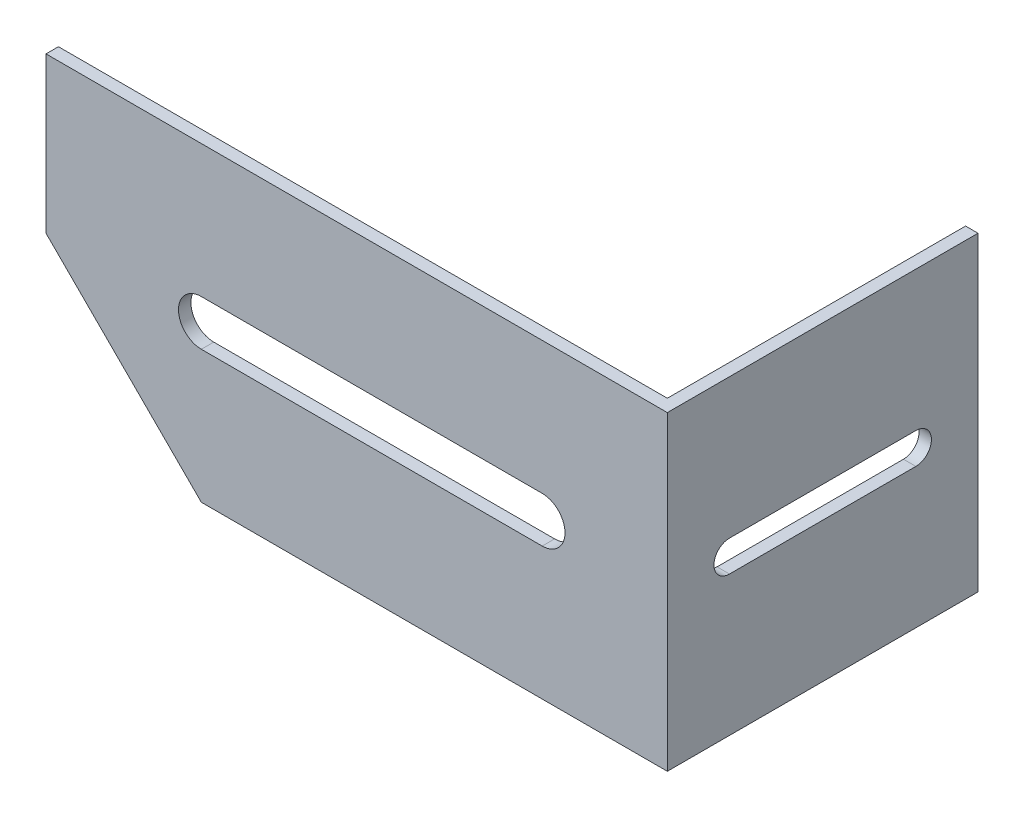
ISO-10303-21;
HEADER;
FILE_DESCRIPTION(('STEP AP214'),'2;1');
FILE_NAME('part.step','',(''),(''),'','','');
FILE_SCHEMA(('AUTOMOTIVE_DESIGN { 1 0 10303 214 1 1 1 1 }'));
ENDSEC;
DATA;
#1=APPLICATION_CONTEXT('core data for automotive mechanical design processes');
#2=APPLICATION_PROTOCOL_DEFINITION('international standard','automotive_design',2000,#1);
#3=PRODUCT_CONTEXT('',#1,'mechanical');
#4=PRODUCT('Part','Part','',(#3));
#5=PRODUCT_RELATED_PRODUCT_CATEGORY('part','',(#4));
#6=PRODUCT_DEFINITION_FORMATION('','',#4);
#7=PRODUCT_DEFINITION_CONTEXT('part definition',#1,'design');
#8=PRODUCT_DEFINITION('design','',#6,#7);
#9=PRODUCT_DEFINITION_SHAPE('','',#8);
#10=(LENGTH_UNIT() NAMED_UNIT(*) SI_UNIT(.MILLI.,.METRE.));
#11=(NAMED_UNIT(*) PLANE_ANGLE_UNIT() SI_UNIT($,.RADIAN.));
#12=(NAMED_UNIT(*) SI_UNIT($,.STERADIAN.) SOLID_ANGLE_UNIT());
#13=UNCERTAINTY_MEASURE_WITH_UNIT(LENGTH_MEASURE(1.E-05),#10,'distance_accuracy_value','');
#14=(GEOMETRIC_REPRESENTATION_CONTEXT(3) GLOBAL_UNCERTAINTY_ASSIGNED_CONTEXT((#13)) GLOBAL_UNIT_ASSIGNED_CONTEXT((#10,
#11,#12)) REPRESENTATION_CONTEXT('',''));
#15=CARTESIAN_POINT('',(0.,0.,0.));
#16=DIRECTION('',(0.,0.,1.));
#17=DIRECTION('',(1.,0.,0.));
#18=AXIS2_PLACEMENT_3D('',#15,#16,#17);
#19=CARTESIAN_POINT('',(0.,0.,50.));
#20=DIRECTION('',(0.,-1.,0.));
#21=DIRECTION('',(0.,0.,-1.));
#22=AXIS2_PLACEMENT_3D('',#19,#20,#21);
#23=PLANE('',#22);
#24=DIRECTION('',(-1.,0.,0.));
#25=VECTOR('',#24,1.);
#26=CARTESIAN_POINT('',(0.,0.,48.));
#27=LINE('',#26,#25);
#28=CARTESIAN_POINT('',(-2.,0.,48.));
#29=VERTEX_POINT('',#28);
#30=CARTESIAN_POINT('',(-75.,0.,48.));
#31=VERTEX_POINT('',#30);
#32=EDGE_CURVE('E178',#29,#31,#27,.T.);
#33=ORIENTED_EDGE('',*,*,#32,.F.);
#34=DIRECTION('',(0.,0.,-1.));
#35=VECTOR('',#34,1.);
#36=CARTESIAN_POINT('',(-2.,0.,50.));
#37=LINE('',#36,#35);
#38=CARTESIAN_POINT('',(-2.,0.,0.));
#39=VERTEX_POINT('',#38);
#40=EDGE_CURVE('E182',#29,#39,#37,.T.);
#41=ORIENTED_EDGE('',*,*,#40,.T.);
#42=DIRECTION('',(-1.,0.,0.));
#43=VECTOR('',#42,1.);
#44=CARTESIAN_POINT('',(0.,0.,0.));
#45=LINE('',#44,#43);
#46=CARTESIAN_POINT('',(0.,0.,0.));
#47=VERTEX_POINT('',#46);
#48=EDGE_CURVE('E185',#47,#39,#45,.T.);
#49=ORIENTED_EDGE('',*,*,#48,.F.);
#50=DIRECTION('',(0.,0.,-1.));
#51=VECTOR('',#50,1.);
#52=CARTESIAN_POINT('',(0.,0.,50.));
#53=LINE('',#52,#51);
#54=CARTESIAN_POINT('',(0.,0.,50.));
#55=VERTEX_POINT('',#54);
#56=EDGE_CURVE('E244',#55,#47,#53,.T.);
#57=ORIENTED_EDGE('',*,*,#56,.F.);
#58=DIRECTION('',(-1.,0.,0.));
#59=VECTOR('',#58,1.);
#60=CARTESIAN_POINT('',(0.,0.,50.));
#61=LINE('',#60,#59);
#62=CARTESIAN_POINT('',(-75.,0.,50.));
#63=VERTEX_POINT('',#62);
#64=EDGE_CURVE('E221',#55,#63,#61,.T.);
#65=ORIENTED_EDGE('',*,*,#64,.T.);
#66=DIRECTION('',(0.,0.,-1.));
#67=VECTOR('',#66,1.);
#68=CARTESIAN_POINT('',(-75.,0.,50.));
#69=LINE('',#68,#67);
#70=EDGE_CURVE('E246',#63,#31,#69,.T.);
#71=ORIENTED_EDGE('',*,*,#70,.T.);
#72=EDGE_LOOP('',(#33,#41,#49,#57,#65,#71));
#73=FACE_BOUND('',#72,.T.);
#74=ADVANCED_FACE('F39',(#73),#23,.T.);
#75=CARTESIAN_POINT('',(-100.,0.,50.));
#76=DIRECTION('',(-1.,0.,0.));
#77=DIRECTION('',(0.,0.,1.));
#78=AXIS2_PLACEMENT_3D('',#75,#76,#77);
#79=PLANE('',#78);
#80=DIRECTION('',(0.,1.,0.));
#81=VECTOR('',#80,1.);
#82=CARTESIAN_POINT('',(-100.,0.,48.));
#83=LINE('',#82,#81);
#84=CARTESIAN_POINT('',(-100.,25.,48.));
#85=VERTEX_POINT('',#84);
#86=CARTESIAN_POINT('',(-100.,50.,48.));
#87=VERTEX_POINT('',#86);
#88=EDGE_CURVE('E190',#85,#87,#83,.T.);
#89=ORIENTED_EDGE('',*,*,#88,.F.);
#90=DIRECTION('',(0.,0.,-1.));
#91=VECTOR('',#90,1.);
#92=CARTESIAN_POINT('',(-100.,25.,50.));
#93=LINE('',#92,#91);
#94=CARTESIAN_POINT('',(-100.,25.,50.));
#95=VERTEX_POINT('',#94);
#96=EDGE_CURVE('E249',#95,#85,#93,.T.);
#97=ORIENTED_EDGE('',*,*,#96,.F.);
#98=DIRECTION('',(0.,1.,0.));
#99=VECTOR('',#98,1.);
#100=CARTESIAN_POINT('',(-100.,0.,50.));
#101=LINE('',#100,#99);
#102=CARTESIAN_POINT('',(-100.,50.,50.));
#103=VERTEX_POINT('',#102);
#104=EDGE_CURVE('E215',#95,#103,#101,.T.);
#105=ORIENTED_EDGE('',*,*,#104,.T.);
#106=DIRECTION('',(0.,0.,-1.));
#107=VECTOR('',#106,1.);
#108=CARTESIAN_POINT('',(-100.,50.,50.));
#109=LINE('',#108,#107);
#110=EDGE_CURVE('E237',#103,#87,#109,.T.);
#111=ORIENTED_EDGE('',*,*,#110,.T.);
#112=EDGE_LOOP('',(#89,#97,#105,#111));
#113=FACE_BOUND('',#112,.T.);
#114=ADVANCED_FACE('F286',(#113),#79,.T.);
#115=CARTESIAN_POINT('',(-37.5,-37.5,50.));
#116=DIRECTION('',(-0.707106781186547,-0.707106781186548,0.));
#117=DIRECTION('',(0.707106781186548,-0.707106781186547,0.));
#118=AXIS2_PLACEMENT_3D('',#115,#116,#117);
#119=PLANE('',#118);
#120=DIRECTION('',(-0.707106781186548,0.707106781186547,0.));
#121=VECTOR('',#120,1.);
#122=CARTESIAN_POINT('',(-37.5,-37.5,48.));
#123=LINE('',#122,#121);
#124=EDGE_CURVE('E188',#31,#85,#123,.T.);
#125=ORIENTED_EDGE('',*,*,#124,.F.);
#126=ORIENTED_EDGE('',*,*,#70,.F.);
#127=DIRECTION('',(-0.707106781186548,0.707106781186547,0.));
#128=VECTOR('',#127,1.);
#129=CARTESIAN_POINT('',(-37.5,-37.5,50.));
#130=LINE('',#129,#128);
#131=EDGE_CURVE('E218',#63,#95,#130,.T.);
#132=ORIENTED_EDGE('',*,*,#131,.T.);
#133=ORIENTED_EDGE('',*,*,#96,.T.);
#134=EDGE_LOOP('',(#125,#126,#132,#133));
#135=FACE_BOUND('',#134,.T.);
#136=ADVANCED_FACE('F292',(#135),#119,.T.);
#137=CARTESIAN_POINT('',(0.,0.,50.));
#138=DIRECTION('',(-1.,0.,0.));
#139=DIRECTION('',(0.,0.,1.));
#140=AXIS2_PLACEMENT_3D('',#137,#138,#139);
#141=PLANE('',#140);
#142=DIRECTION('',(0.,0.,-1.));
#143=VECTOR('',#142,1.);
#144=CARTESIAN_POINT('',(0.,22.5,40.));
#145=LINE('',#144,#143);
#146=CARTESIAN_POINT('',(0.,22.5,40.));
#147=VERTEX_POINT('',#146);
#148=CARTESIAN_POINT('',(0.,22.5,10.));
#149=VERTEX_POINT('',#148);
#150=EDGE_CURVE('E157',#147,#149,#145,.T.);
#151=ORIENTED_EDGE('',*,*,#150,.F.);
#152=CARTESIAN_POINT('',(0.,25.,40.));
#153=DIRECTION('',(1.,0.,0.));
#154=DIRECTION('',(0.,0.,-1.));
#155=AXIS2_PLACEMENT_3D('',#152,#153,#154);
#156=CIRCLE('',#155,2.5);
#157=CARTESIAN_POINT('',(0.,27.5,40.));
#158=VERTEX_POINT('',#157);
#159=EDGE_CURVE('E54',#158,#147,#156,.T.);
#160=ORIENTED_EDGE('',*,*,#159,.F.);
#161=DIRECTION('',(0.,0.,1.));
#162=VECTOR('',#161,1.);
#163=CARTESIAN_POINT('',(0.,27.5,40.));
#164=LINE('',#163,#162);
#165=CARTESIAN_POINT('',(0.,27.5,10.));
#166=VERTEX_POINT('',#165);
#167=EDGE_CURVE('E164',#166,#158,#164,.T.);
#168=ORIENTED_EDGE('',*,*,#167,.F.);
#169=CARTESIAN_POINT('',(0.,25.,10.));
#170=DIRECTION('',(1.,0.,0.));
#171=DIRECTION('',(0.,0.,-1.));
#172=AXIS2_PLACEMENT_3D('',#169,#170,#171);
#173=CIRCLE('',#172,2.5);
#174=EDGE_CURVE('E148',#149,#166,#173,.T.);
#175=ORIENTED_EDGE('',*,*,#174,.F.);
#176=EDGE_LOOP('',(#151,#160,#168,#175));
#177=FACE_BOUND('',#176,.T.);
#178=DIRECTION('',(0.,1.,0.));
#179=VECTOR('',#178,1.);
#180=CARTESIAN_POINT('',(0.,0.,0.));
#181=LINE('',#180,#179);
#182=CARTESIAN_POINT('',(0.,50.,0.));
#183=VERTEX_POINT('',#182);
#184=EDGE_CURVE('E232',#47,#183,#181,.T.);
#185=ORIENTED_EDGE('',*,*,#184,.T.);
#186=DIRECTION('',(0.,0.,-1.));
#187=VECTOR('',#186,1.);
#188=CARTESIAN_POINT('',(0.,50.,50.));
#189=LINE('',#188,#187);
#190=CARTESIAN_POINT('',(0.,50.,50.));
#191=VERTEX_POINT('',#190);
#192=EDGE_CURVE('E240',#191,#183,#189,.T.);
#193=ORIENTED_EDGE('',*,*,#192,.F.);
#194=DIRECTION('',(0.,1.,0.));
#195=VECTOR('',#194,1.);
#196=CARTESIAN_POINT('',(0.,0.,50.));
#197=LINE('',#196,#195);
#198=EDGE_CURVE('E224',#55,#191,#197,.T.);
#199=ORIENTED_EDGE('',*,*,#198,.F.);
#200=ORIENTED_EDGE('',*,*,#56,.T.);
#201=EDGE_LOOP('',(#185,#193,#199,#200));
#202=FACE_BOUND('',#201,.T.);
#203=ADVANCED_FACE('F161',(#177,#202),#141,.F.);
#204=CARTESIAN_POINT('',(-20.1421800947867,25.,50.));
#205=DIRECTION('',(0.,0.,-1.));
#206=DIRECTION('',(-1.,0.,0.));
#207=AXIS2_PLACEMENT_3D('',#204,#205,#206);
#208=CYLINDRICAL_SURFACE('',#207,3.67298578199052);
#209=CARTESIAN_POINT('',(-20.1421800947867,25.,48.));
#210=DIRECTION('',(0.,0.,1.));
#211=DIRECTION('',(1.,0.,0.));
#212=AXIS2_PLACEMENT_3D('',#209,#210,#211);
#213=CIRCLE('',#212,3.67298578199052);
#214=CARTESIAN_POINT('',(-20.1421800947867,21.3270142180095,48.));
#215=VERTEX_POINT('',#214);
#216=CARTESIAN_POINT('',(-20.1421800947867,28.6729857819905,48.));
#217=VERTEX_POINT('',#216);
#218=EDGE_CURVE('E181',#215,#217,#213,.T.);
#219=ORIENTED_EDGE('',*,*,#218,.F.);
#220=DIRECTION('',(0.,0.,-1.));
#221=VECTOR('',#220,1.);
#222=CARTESIAN_POINT('',(-20.1421800947867,21.3270142180095,50.));
#223=LINE('',#222,#221);
#224=CARTESIAN_POINT('',(-20.1421800947867,21.3270142180095,50.));
#225=VERTEX_POINT('',#224);
#226=EDGE_CURVE('E241',#225,#215,#223,.T.);
#227=ORIENTED_EDGE('',*,*,#226,.F.);
#228=CARTESIAN_POINT('',(-20.1421800947867,25.,50.));
#229=DIRECTION('',(0.,0.,1.));
#230=DIRECTION('',(1.,0.,0.));
#231=AXIS2_PLACEMENT_3D('',#228,#229,#230);
#232=CIRCLE('',#231,3.67298578199052);
#233=CARTESIAN_POINT('',(-20.1421800947867,28.6729857819905,50.));
#234=VERTEX_POINT('',#233);
#235=EDGE_CURVE('E203',#225,#234,#232,.T.);
#236=ORIENTED_EDGE('',*,*,#235,.T.);
#237=DIRECTION('',(0.,0.,-1.));
#238=VECTOR('',#237,1.);
#239=CARTESIAN_POINT('',(-20.1421800947867,28.6729857819905,50.));
#240=LINE('',#239,#238);
#241=EDGE_CURVE('E229',#234,#217,#240,.T.);
#242=ORIENTED_EDGE('',*,*,#241,.T.);
#243=EDGE_LOOP('',(#219,#227,#236,#242));
#244=FACE_BOUND('',#243,.T.);
#245=ADVANCED_FACE('F41',(#244),#208,.F.);
#246=CARTESIAN_POINT('',(0.,21.3270142180095,50.));
#247=DIRECTION('',(0.,1.,0.));
#248=DIRECTION('',(0.,0.,1.));
#249=AXIS2_PLACEMENT_3D('',#246,#247,#248);
#250=PLANE('',#249);
#251=DIRECTION('',(1.,0.,0.));
#252=VECTOR('',#251,1.);
#253=CARTESIAN_POINT('',(0.,21.3270142180095,48.));
#254=LINE('',#253,#252);
#255=CARTESIAN_POINT('',(-75.,21.3270142180095,48.));
#256=VERTEX_POINT('',#255);
#257=EDGE_CURVE('E197',#256,#215,#254,.T.);
#258=ORIENTED_EDGE('',*,*,#257,.F.);
#259=DIRECTION('',(0.,0.,-1.));
#260=VECTOR('',#259,1.);
#261=CARTESIAN_POINT('',(-75.,21.3270142180095,50.));
#262=LINE('',#261,#260);
#263=CARTESIAN_POINT('',(-75.,21.3270142180095,50.));
#264=VERTEX_POINT('',#263);
#265=EDGE_CURVE('E258',#264,#256,#262,.T.);
#266=ORIENTED_EDGE('',*,*,#265,.F.);
#267=DIRECTION('',(1.,0.,0.));
#268=VECTOR('',#267,1.);
#269=CARTESIAN_POINT('',(0.,21.3270142180095,50.));
#270=LINE('',#269,#268);
#271=EDGE_CURVE('E206',#264,#225,#270,.T.);
#272=ORIENTED_EDGE('',*,*,#271,.T.);
#273=ORIENTED_EDGE('',*,*,#226,.T.);
#274=EDGE_LOOP('',(#258,#266,#272,#273));
#275=FACE_BOUND('',#274,.T.);
#276=ADVANCED_FACE('F309',(#275),#250,.T.);
#277=CARTESIAN_POINT('',(-75.,25.,50.));
#278=DIRECTION('',(0.,0.,-1.));
#279=DIRECTION('',(-1.,0.,0.));
#280=AXIS2_PLACEMENT_3D('',#277,#278,#279);
#281=CYLINDRICAL_SURFACE('',#280,3.67298578199052);
#282=CARTESIAN_POINT('',(-75.,25.,48.));
#283=DIRECTION('',(0.,0.,1.));
#284=DIRECTION('',(1.,0.,0.));
#285=AXIS2_PLACEMENT_3D('',#282,#283,#284);
#286=CIRCLE('',#285,3.67298578199052);
#287=CARTESIAN_POINT('',(-75.,28.6729857819905,48.));
#288=VERTEX_POINT('',#287);
#289=EDGE_CURVE('E200',#288,#256,#286,.T.);
#290=ORIENTED_EDGE('',*,*,#289,.F.);
#291=DIRECTION('',(0.,0.,-1.));
#292=VECTOR('',#291,1.);
#293=CARTESIAN_POINT('',(-75.,28.6729857819905,50.));
#294=LINE('',#293,#292);
#295=CARTESIAN_POINT('',(-75.,28.6729857819905,50.));
#296=VERTEX_POINT('',#295);
#297=EDGE_CURVE('E255',#296,#288,#294,.T.);
#298=ORIENTED_EDGE('',*,*,#297,.F.);
#299=CARTESIAN_POINT('',(-75.,25.,50.));
#300=DIRECTION('',(0.,0.,1.));
#301=DIRECTION('',(1.,0.,0.));
#302=AXIS2_PLACEMENT_3D('',#299,#300,#301);
#303=CIRCLE('',#302,3.67298578199052);
#304=EDGE_CURVE('E210',#296,#264,#303,.T.);
#305=ORIENTED_EDGE('',*,*,#304,.T.);
#306=ORIENTED_EDGE('',*,*,#265,.T.);
#307=EDGE_LOOP('',(#290,#298,#305,#306));
#308=FACE_BOUND('',#307,.T.);
#309=ADVANCED_FACE('F306',(#308),#281,.F.);
#310=CARTESIAN_POINT('',(0.,28.6729857819905,50.));
#311=DIRECTION('',(0.,1.,0.));
#312=DIRECTION('',(0.,0.,1.));
#313=AXIS2_PLACEMENT_3D('',#310,#311,#312);
#314=PLANE('',#313);
#315=ORIENTED_EDGE('',*,*,#297,.T.);
#316=DIRECTION('',(1.,0.,0.));
#317=VECTOR('',#316,1.);
#318=CARTESIAN_POINT('',(0.,28.6729857819905,48.));
#319=LINE('',#318,#317);
#320=EDGE_CURVE('E192',#288,#217,#319,.T.);
#321=ORIENTED_EDGE('',*,*,#320,.T.);
#322=ORIENTED_EDGE('',*,*,#241,.F.);
#323=DIRECTION('',(1.,0.,0.));
#324=VECTOR('',#323,1.);
#325=CARTESIAN_POINT('',(0.,28.6729857819905,50.));
#326=LINE('',#325,#324);
#327=EDGE_CURVE('E213',#296,#234,#326,.T.);
#328=ORIENTED_EDGE('',*,*,#327,.F.);
#329=EDGE_LOOP('',(#315,#321,#322,#328));
#330=FACE_BOUND('',#329,.T.);
#331=ADVANCED_FACE('F302',(#330),#314,.F.);
#332=CARTESIAN_POINT('',(0.,50.,50.));
#333=DIRECTION('',(0.,-1.,0.));
#334=DIRECTION('',(1.,0.,0.));
#335=AXIS2_PLACEMENT_3D('',#332,#333,#334);
#336=PLANE('',#335);
#337=DIRECTION('',(0.,0.,-1.));
#338=VECTOR('',#337,1.);
#339=CARTESIAN_POINT('',(-2.,50.,50.));
#340=LINE('',#339,#338);
#341=CARTESIAN_POINT('',(-2.,50.,48.));
#342=VERTEX_POINT('',#341);
#343=CARTESIAN_POINT('',(-2.,50.,0.));
#344=VERTEX_POINT('',#343);
#345=EDGE_CURVE('E186',#342,#344,#340,.T.);
#346=ORIENTED_EDGE('',*,*,#345,.F.);
#347=DIRECTION('',(-1.,0.,0.));
#348=VECTOR('',#347,1.);
#349=CARTESIAN_POINT('',(0.,50.,48.));
#350=LINE('',#349,#348);
#351=EDGE_CURVE('E177',#342,#87,#350,.T.);
#352=ORIENTED_EDGE('',*,*,#351,.T.);
#353=ORIENTED_EDGE('',*,*,#110,.F.);
#354=DIRECTION('',(-1.,0.,0.));
#355=VECTOR('',#354,1.);
#356=CARTESIAN_POINT('',(0.,50.,50.));
#357=LINE('',#356,#355);
#358=EDGE_CURVE('E227',#191,#103,#357,.T.);
#359=ORIENTED_EDGE('',*,*,#358,.F.);
#360=ORIENTED_EDGE('',*,*,#192,.T.);
#361=DIRECTION('',(-1.,0.,0.));
#362=VECTOR('',#361,1.);
#363=CARTESIAN_POINT('',(0.,50.,0.));
#364=LINE('',#363,#362);
#365=EDGE_CURVE('E207',#183,#344,#364,.T.);
#366=ORIENTED_EDGE('',*,*,#365,.T.);
#367=EDGE_LOOP('',(#346,#352,#353,#359,#360,#366));
#368=FACE_BOUND('',#367,.T.);
#369=ADVANCED_FACE('F305',(#368),#336,.F.);
#370=CARTESIAN_POINT('',(0.,0.,50.));
#371=DIRECTION('',(0.,0.,1.));
#372=DIRECTION('',(1.,0.,0.));
#373=AXIS2_PLACEMENT_3D('',#370,#371,#372);
#374=PLANE('',#373);
#375=ORIENTED_EDGE('',*,*,#235,.F.);
#376=ORIENTED_EDGE('',*,*,#271,.F.);
#377=ORIENTED_EDGE('',*,*,#304,.F.);
#378=ORIENTED_EDGE('',*,*,#327,.T.);
#379=EDGE_LOOP('',(#375,#376,#377,#378));
#380=FACE_BOUND('',#379,.T.);
#381=ORIENTED_EDGE('',*,*,#104,.F.);
#382=ORIENTED_EDGE('',*,*,#131,.F.);
#383=ORIENTED_EDGE('',*,*,#64,.F.);
#384=ORIENTED_EDGE('',*,*,#198,.T.);
#385=ORIENTED_EDGE('',*,*,#358,.T.);
#386=EDGE_LOOP('',(#381,#382,#383,#384,#385));
#387=FACE_BOUND('',#386,.T.);
#388=ADVANCED_FACE('F325',(#380,#387),#374,.T.);
#389=CARTESIAN_POINT('',(0.,0.,0.));
#390=DIRECTION('',(0.,0.,1.));
#391=DIRECTION('',(1.,0.,0.));
#392=AXIS2_PLACEMENT_3D('',#389,#390,#391);
#393=PLANE('',#392);
#394=ORIENTED_EDGE('',*,*,#48,.T.);
#395=DIRECTION('',(0.,1.,0.));
#396=VECTOR('',#395,1.);
#397=CARTESIAN_POINT('',(-2.,0.,0.));
#398=LINE('',#397,#396);
#399=EDGE_CURVE('E171',#39,#344,#398,.T.);
#400=ORIENTED_EDGE('',*,*,#399,.T.);
#401=ORIENTED_EDGE('',*,*,#365,.F.);
#402=ORIENTED_EDGE('',*,*,#184,.F.);
#403=EDGE_LOOP('',(#394,#400,#401,#402));
#404=FACE_BOUND('',#403,.T.);
#405=ADVANCED_FACE('F343',(#404),#393,.F.);
#406=CARTESIAN_POINT('',(-2.,0.,50.));
#407=DIRECTION('',(-1.,0.,0.));
#408=DIRECTION('',(0.,0.,1.));
#409=AXIS2_PLACEMENT_3D('',#406,#407,#408);
#410=PLANE('',#409);
#411=CARTESIAN_POINT('',(-2.,25.,40.));
#412=DIRECTION('',(-1.,0.,0.));
#413=DIRECTION('',(0.,0.,1.));
#414=AXIS2_PLACEMENT_3D('',#411,#412,#413);
#415=CIRCLE('',#414,2.5);
#416=CARTESIAN_POINT('',(-2.00000000000002,22.5,40.));
#417=VERTEX_POINT('',#416);
#418=CARTESIAN_POINT('',(-2.00000000000002,27.5,40.));
#419=VERTEX_POINT('',#418);
#420=EDGE_CURVE('E11',#417,#419,#415,.T.);
#421=ORIENTED_EDGE('',*,*,#420,.F.);
#422=DIRECTION('',(0.,0.,1.));
#423=VECTOR('',#422,1.);
#424=CARTESIAN_POINT('',(-2.,22.5,50.));
#425=LINE('',#424,#423);
#426=CARTESIAN_POINT('',(-2.,22.5,10.));
#427=VERTEX_POINT('',#426);
#428=EDGE_CURVE('E252',#427,#417,#425,.T.);
#429=ORIENTED_EDGE('',*,*,#428,.F.);
#430=CARTESIAN_POINT('',(-2.,25.,10.));
#431=DIRECTION('',(-1.,0.,0.));
#432=DIRECTION('',(0.,0.,1.));
#433=AXIS2_PLACEMENT_3D('',#430,#431,#432);
#434=CIRCLE('',#433,2.5);
#435=CARTESIAN_POINT('',(-2.00000000000002,27.5,10.));
#436=VERTEX_POINT('',#435);
#437=EDGE_CURVE('E151',#436,#427,#434,.T.);
#438=ORIENTED_EDGE('',*,*,#437,.F.);
#439=DIRECTION('',(0.,0.,-1.));
#440=VECTOR('',#439,1.);
#441=CARTESIAN_POINT('',(-2.,27.5,50.));
#442=LINE('',#441,#440);
#443=EDGE_CURVE('E47',#419,#436,#442,.T.);
#444=ORIENTED_EDGE('',*,*,#443,.F.);
#445=EDGE_LOOP('',(#421,#429,#438,#444));
#446=FACE_BOUND('',#445,.T.);
#447=ORIENTED_EDGE('',*,*,#399,.F.);
#448=ORIENTED_EDGE('',*,*,#40,.F.);
#449=DIRECTION('',(0.,1.,0.));
#450=VECTOR('',#449,1.);
#451=CARTESIAN_POINT('',(-2.,0.,48.));
#452=LINE('',#451,#450);
#453=EDGE_CURVE('E174',#29,#342,#452,.T.);
#454=ORIENTED_EDGE('',*,*,#453,.T.);
#455=ORIENTED_EDGE('',*,*,#345,.T.);
#456=EDGE_LOOP('',(#447,#448,#454,#455));
#457=FACE_BOUND('',#456,.T.);
#458=ADVANCED_FACE('F270',(#446,#457),#410,.T.);
#459=CARTESIAN_POINT('',(0.,0.,48.));
#460=DIRECTION('',(0.,0.,1.));
#461=DIRECTION('',(1.,0.,0.));
#462=AXIS2_PLACEMENT_3D('',#459,#460,#461);
#463=PLANE('',#462);
#464=ORIENTED_EDGE('',*,*,#218,.T.);
#465=ORIENTED_EDGE('',*,*,#320,.F.);
#466=ORIENTED_EDGE('',*,*,#289,.T.);
#467=ORIENTED_EDGE('',*,*,#257,.T.);
#468=EDGE_LOOP('',(#464,#465,#466,#467));
#469=FACE_BOUND('',#468,.T.);
#470=ORIENTED_EDGE('',*,*,#88,.T.);
#471=ORIENTED_EDGE('',*,*,#351,.F.);
#472=ORIENTED_EDGE('',*,*,#453,.F.);
#473=ORIENTED_EDGE('',*,*,#32,.T.);
#474=ORIENTED_EDGE('',*,*,#124,.T.);
#475=EDGE_LOOP('',(#470,#471,#472,#473,#474));
#476=FACE_BOUND('',#475,.T.);
#477=ADVANCED_FACE('F274',(#469,#476),#463,.F.);
#478=CARTESIAN_POINT('',(-60.,25.,40.));
#479=DIRECTION('',(1.,0.,0.));
#480=DIRECTION('',(0.,0.,-1.));
#481=AXIS2_PLACEMENT_3D('',#478,#479,#480);
#482=CYLINDRICAL_SURFACE('',#481,2.5);
#483=ORIENTED_EDGE('',*,*,#420,.T.);
#484=DIRECTION('',(1.,0.,0.));
#485=VECTOR('',#484,1.);
#486=CARTESIAN_POINT('',(-60.,27.5,40.));
#487=LINE('',#486,#485);
#488=EDGE_CURVE('E169',#419,#158,#487,.T.);
#489=ORIENTED_EDGE('',*,*,#488,.T.);
#490=ORIENTED_EDGE('',*,*,#159,.T.);
#491=DIRECTION('',(1.,0.,0.));
#492=VECTOR('',#491,1.);
#493=CARTESIAN_POINT('',(-60.,22.5,40.));
#494=LINE('',#493,#492);
#495=EDGE_CURVE('E154',#417,#147,#494,.T.);
#496=ORIENTED_EDGE('',*,*,#495,.F.);
#497=EDGE_LOOP('',(#483,#489,#490,#496));
#498=FACE_BOUND('',#497,.T.);
#499=ADVANCED_FACE('F272',(#498),#482,.F.);
#500=CARTESIAN_POINT('',(-60.,27.5,40.));
#501=DIRECTION('',(0.,1.,0.));
#502=DIRECTION('',(0.,0.,1.));
#503=AXIS2_PLACEMENT_3D('',#500,#501,#502);
#504=PLANE('',#503);
#505=ORIENTED_EDGE('',*,*,#443,.T.);
#506=DIRECTION('',(1.,0.,0.));
#507=VECTOR('',#506,1.);
#508=CARTESIAN_POINT('',(-60.,27.5,10.));
#509=LINE('',#508,#507);
#510=EDGE_CURVE('E153',#436,#166,#509,.T.);
#511=ORIENTED_EDGE('',*,*,#510,.T.);
#512=ORIENTED_EDGE('',*,*,#167,.T.);
#513=ORIENTED_EDGE('',*,*,#488,.F.);
#514=EDGE_LOOP('',(#505,#511,#512,#513));
#515=FACE_BOUND('',#514,.T.);
#516=ADVANCED_FACE('F267',(#515),#504,.F.);
#517=CARTESIAN_POINT('',(-60.,25.,10.));
#518=DIRECTION('',(1.,0.,0.));
#519=DIRECTION('',(0.,0.,-1.));
#520=AXIS2_PLACEMENT_3D('',#517,#518,#519);
#521=CYLINDRICAL_SURFACE('',#520,2.5);
#522=ORIENTED_EDGE('',*,*,#437,.T.);
#523=DIRECTION('',(1.,0.,0.));
#524=VECTOR('',#523,1.);
#525=CARTESIAN_POINT('',(-60.,22.5,10.));
#526=LINE('',#525,#524);
#527=EDGE_CURVE('E62',#427,#149,#526,.T.);
#528=ORIENTED_EDGE('',*,*,#527,.T.);
#529=ORIENTED_EDGE('',*,*,#174,.T.);
#530=ORIENTED_EDGE('',*,*,#510,.F.);
#531=EDGE_LOOP('',(#522,#528,#529,#530));
#532=FACE_BOUND('',#531,.T.);
#533=ADVANCED_FACE('F145',(#532),#521,.F.);
#534=CARTESIAN_POINT('',(-60.,22.5,40.));
#535=DIRECTION('',(0.,-1.,0.));
#536=DIRECTION('',(0.,0.,-1.));
#537=AXIS2_PLACEMENT_3D('',#534,#535,#536);
#538=PLANE('',#537);
#539=ORIENTED_EDGE('',*,*,#428,.T.);
#540=ORIENTED_EDGE('',*,*,#495,.T.);
#541=ORIENTED_EDGE('',*,*,#150,.T.);
#542=ORIENTED_EDGE('',*,*,#527,.F.);
#543=EDGE_LOOP('',(#539,#540,#541,#542));
#544=FACE_BOUND('',#543,.T.);
#545=ADVANCED_FACE('F158',(#544),#538,.F.);
#546=CLOSED_SHELL('',(#74,#114,#136,#203,#245,#276,#309,#331,#369,#388,#405,#458,#477,#499,#516,
#533,#545));
#547=MANIFOLD_SOLID_BREP('B2',#546);
#548=ADVANCED_BREP_SHAPE_REPRESENTATION('',(#18,#547),#14);
#549=SHAPE_DEFINITION_REPRESENTATION(#9,#548);
ENDSEC;
END-ISO-10303-21;
